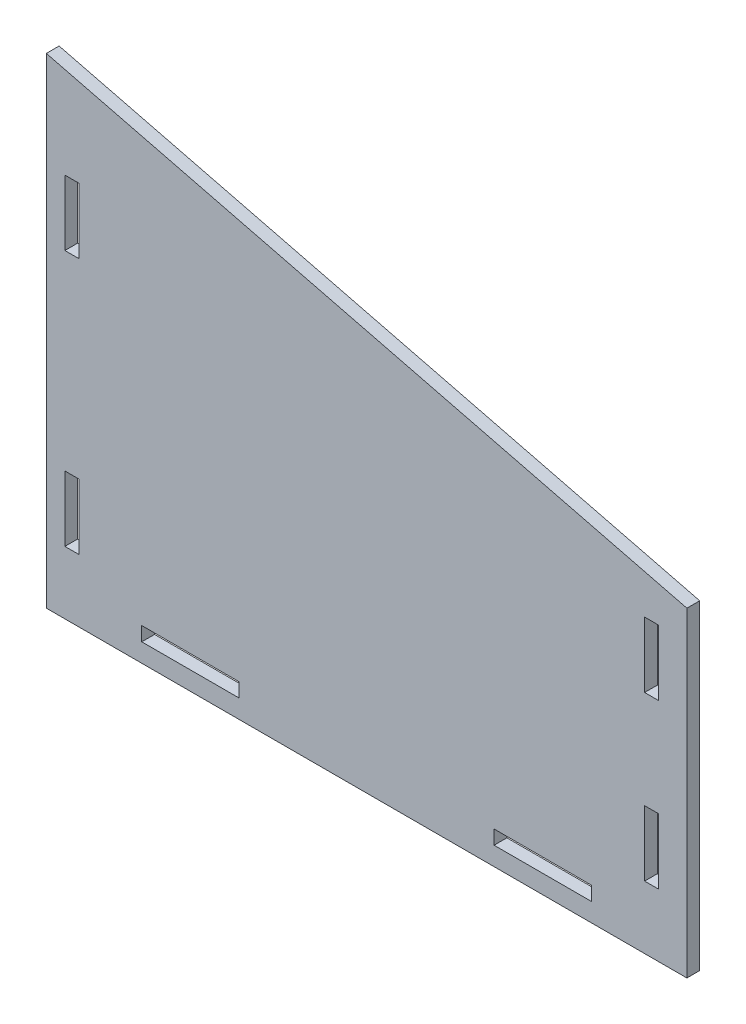
ISO-10303-21;
HEADER;
FILE_DESCRIPTION(('STEP AP214'),'2;1');
FILE_NAME('part.step','',(''),(''),'','','');
FILE_SCHEMA(('AUTOMOTIVE_DESIGN { 1 0 10303 214 1 1 1 1 }'));
ENDSEC;
DATA;
#1=APPLICATION_CONTEXT('core data for automotive mechanical design processes');
#2=APPLICATION_PROTOCOL_DEFINITION('international standard','automotive_design',2000,#1);
#3=PRODUCT_CONTEXT('',#1,'mechanical');
#4=PRODUCT('Part','Part','',(#3));
#5=PRODUCT_RELATED_PRODUCT_CATEGORY('part','',(#4));
#6=PRODUCT_DEFINITION_FORMATION('','',#4);
#7=PRODUCT_DEFINITION_CONTEXT('part definition',#1,'design');
#8=PRODUCT_DEFINITION('design','',#6,#7);
#9=PRODUCT_DEFINITION_SHAPE('','',#8);
#10=(LENGTH_UNIT() NAMED_UNIT(*) SI_UNIT(.MILLI.,.METRE.));
#11=(NAMED_UNIT(*) PLANE_ANGLE_UNIT() SI_UNIT($,.RADIAN.));
#12=(NAMED_UNIT(*) SI_UNIT($,.STERADIAN.) SOLID_ANGLE_UNIT());
#13=UNCERTAINTY_MEASURE_WITH_UNIT(LENGTH_MEASURE(1.E-05),#10,'distance_accuracy_value','');
#14=(GEOMETRIC_REPRESENTATION_CONTEXT(3) GLOBAL_UNCERTAINTY_ASSIGNED_CONTEXT((#13)) GLOBAL_UNIT_ASSIGNED_CONTEXT((#10,
#11,#12)) REPRESENTATION_CONTEXT('',''));
#15=CARTESIAN_POINT('',(0.,0.,0.));
#16=DIRECTION('',(0.,0.,1.));
#17=DIRECTION('',(1.,0.,0.));
#18=AXIS2_PLACEMENT_3D('',#15,#16,#17);
#19=CARTESIAN_POINT('',(0.,0.,4.));
#20=DIRECTION('',(0.,0.,1.));
#21=DIRECTION('',(1.,0.,0.));
#22=AXIS2_PLACEMENT_3D('',#19,#20,#21);
#23=PLANE('',#22);
#24=DIRECTION('',(1.,0.,0.));
#25=VECTOR('',#24,1.);
#26=CARTESIAN_POINT('',(0.,0.,4.));
#27=LINE('',#26,#25);
#28=CARTESIAN_POINT('',(0.,0.,4.));
#29=VERTEX_POINT('',#28);
#30=CARTESIAN_POINT('',(200.,0.,4.));
#31=VERTEX_POINT('',#30);
#32=EDGE_CURVE('E411',#29,#31,#27,.T.);
#33=ORIENTED_EDGE('',*,*,#32,.T.);
#34=DIRECTION('',(0.,1.,0.));
#35=VECTOR('',#34,1.);
#36=CARTESIAN_POINT('',(200.,0.,4.));
#37=LINE('',#36,#35);
#38=CARTESIAN_POINT('',(200.,100.,4.));
#39=VERTEX_POINT('',#38);
#40=EDGE_CURVE('E414',#31,#39,#37,.T.);
#41=ORIENTED_EDGE('',*,*,#40,.T.);
#42=DIRECTION('',(-0.970142500145332,0.242535625036333,0.));
#43=VECTOR('',#42,1.);
#44=CARTESIAN_POINT('',(200.,100.,4.));
#45=LINE('',#44,#43);
#46=CARTESIAN_POINT('',(0.,150.,4.));
#47=VERTEX_POINT('',#46);
#48=EDGE_CURVE('E417',#39,#47,#45,.T.);
#49=ORIENTED_EDGE('',*,*,#48,.T.);
#50=DIRECTION('',(0.,-1.,0.));
#51=VECTOR('',#50,1.);
#52=CARTESIAN_POINT('',(0.,0.,4.));
#53=LINE('',#52,#51);
#54=EDGE_CURVE('E419',#47,#29,#53,.T.);
#55=ORIENTED_EDGE('',*,*,#54,.T.);
#56=EDGE_LOOP('',(#33,#41,#49,#55));
#57=FACE_BOUND('',#56,.T.);
#58=DIRECTION('',(1.,0.,0.));
#59=VECTOR('',#58,1.);
#60=CARTESIAN_POINT('',(186.8,19.6,4.));
#61=LINE('',#60,#59);
#62=CARTESIAN_POINT('',(186.8,19.6,4.));
#63=VERTEX_POINT('',#62);
#64=CARTESIAN_POINT('',(191.2,19.6,4.));
#65=VERTEX_POINT('',#64);
#66=EDGE_CURVE('E382',#63,#65,#61,.T.);
#67=ORIENTED_EDGE('',*,*,#66,.F.);
#68=DIRECTION('',(0.,-1.,0.));
#69=VECTOR('',#68,1.);
#70=CARTESIAN_POINT('',(186.8,40.,4.));
#71=LINE('',#70,#69);
#72=CARTESIAN_POINT('',(186.8,40.,4.));
#73=VERTEX_POINT('',#72);
#74=EDGE_CURVE('E380',#73,#63,#71,.T.);
#75=ORIENTED_EDGE('',*,*,#74,.F.);
#76=DIRECTION('',(-1.,0.,0.));
#77=VECTOR('',#76,1.);
#78=CARTESIAN_POINT('',(186.8,40.,4.));
#79=LINE('',#78,#77);
#80=CARTESIAN_POINT('',(191.2,40.,4.));
#81=VERTEX_POINT('',#80);
#82=EDGE_CURVE('E388',#81,#73,#79,.T.);
#83=ORIENTED_EDGE('',*,*,#82,.F.);
#84=DIRECTION('',(0.,1.,0.));
#85=VECTOR('',#84,1.);
#86=CARTESIAN_POINT('',(191.2,40.,4.));
#87=LINE('',#86,#85);
#88=EDGE_CURVE('E385',#65,#81,#87,.T.);
#89=ORIENTED_EDGE('',*,*,#88,.F.);
#90=EDGE_LOOP('',(#67,#75,#83,#89));
#91=FACE_BOUND('',#90,.T.);
#92=DIRECTION('',(1.,0.,0.));
#93=VECTOR('',#92,1.);
#94=CARTESIAN_POINT('',(139.8,5.8,4.));
#95=LINE('',#94,#93);
#96=CARTESIAN_POINT('',(139.8,5.8,4.));
#97=VERTEX_POINT('',#96);
#98=CARTESIAN_POINT('',(170.2,5.8,4.));
#99=VERTEX_POINT('',#98);
#100=EDGE_CURVE('E351',#97,#99,#95,.T.);
#101=ORIENTED_EDGE('',*,*,#100,.F.);
#102=DIRECTION('',(0.,-1.,0.));
#103=VECTOR('',#102,1.);
#104=CARTESIAN_POINT('',(139.8,10.2,4.));
#105=LINE('',#104,#103);
#106=CARTESIAN_POINT('',(139.8,10.2,4.));
#107=VERTEX_POINT('',#106);
#108=EDGE_CURVE('E349',#107,#97,#105,.T.);
#109=ORIENTED_EDGE('',*,*,#108,.F.);
#110=DIRECTION('',(-1.,0.,0.));
#111=VECTOR('',#110,1.);
#112=CARTESIAN_POINT('',(139.8,10.2,4.));
#113=LINE('',#112,#111);
#114=CARTESIAN_POINT('',(170.2,10.2,4.));
#115=VERTEX_POINT('',#114);
#116=EDGE_CURVE('E357',#115,#107,#113,.T.);
#117=ORIENTED_EDGE('',*,*,#116,.F.);
#118=DIRECTION('',(0.,1.,0.));
#119=VECTOR('',#118,1.);
#120=CARTESIAN_POINT('',(170.2,10.2,4.));
#121=LINE('',#120,#119);
#122=EDGE_CURVE('E354',#99,#115,#121,.T.);
#123=ORIENTED_EDGE('',*,*,#122,.F.);
#124=EDGE_LOOP('',(#101,#109,#117,#123));
#125=FACE_BOUND('',#124,.T.);
#126=DIRECTION('',(1.,0.,0.));
#127=VECTOR('',#126,1.);
#128=CARTESIAN_POINT('',(5.8,19.6,4.));
#129=LINE('',#128,#127);
#130=CARTESIAN_POINT('',(5.8,19.6,4.));
#131=VERTEX_POINT('',#130);
#132=CARTESIAN_POINT('',(10.2,19.6,4.));
#133=VERTEX_POINT('',#132);
#134=EDGE_CURVE('E320',#131,#133,#129,.T.);
#135=ORIENTED_EDGE('',*,*,#134,.F.);
#136=DIRECTION('',(0.,-1.,0.));
#137=VECTOR('',#136,1.);
#138=CARTESIAN_POINT('',(5.8,40.,4.));
#139=LINE('',#138,#137);
#140=CARTESIAN_POINT('',(5.8,40.,4.));
#141=VERTEX_POINT('',#140);
#142=EDGE_CURVE('E318',#141,#131,#139,.T.);
#143=ORIENTED_EDGE('',*,*,#142,.F.);
#144=DIRECTION('',(-1.,0.,0.));
#145=VECTOR('',#144,1.);
#146=CARTESIAN_POINT('',(5.8,40.,4.));
#147=LINE('',#146,#145);
#148=CARTESIAN_POINT('',(10.2,40.,4.));
#149=VERTEX_POINT('',#148);
#150=EDGE_CURVE('E326',#149,#141,#147,.T.);
#151=ORIENTED_EDGE('',*,*,#150,.F.);
#152=DIRECTION('',(0.,1.,0.));
#153=VECTOR('',#152,1.);
#154=CARTESIAN_POINT('',(10.2,40.,4.));
#155=LINE('',#154,#153);
#156=EDGE_CURVE('E323',#133,#149,#155,.T.);
#157=ORIENTED_EDGE('',*,*,#156,.F.);
#158=EDGE_LOOP('',(#135,#143,#151,#157));
#159=FACE_BOUND('',#158,.T.);
#160=DIRECTION('',(-1.,0.,0.));
#161=VECTOR('',#160,1.);
#162=CARTESIAN_POINT('',(60.2,10.2,4.));
#163=LINE('',#162,#161);
#164=CARTESIAN_POINT('',(60.2,10.2,4.));
#165=VERTEX_POINT('',#164);
#166=CARTESIAN_POINT('',(29.8,10.2,4.));
#167=VERTEX_POINT('',#166);
#168=EDGE_CURVE('E289',#165,#167,#163,.T.);
#169=ORIENTED_EDGE('',*,*,#168,.F.);
#170=DIRECTION('',(0.,1.,0.));
#171=VECTOR('',#170,1.);
#172=CARTESIAN_POINT('',(60.2,10.2,4.));
#173=LINE('',#172,#171);
#174=CARTESIAN_POINT('',(60.2,5.8,4.));
#175=VERTEX_POINT('',#174);
#176=EDGE_CURVE('E287',#175,#165,#173,.T.);
#177=ORIENTED_EDGE('',*,*,#176,.F.);
#178=DIRECTION('',(1.,0.,0.));
#179=VECTOR('',#178,1.);
#180=CARTESIAN_POINT('',(60.2,5.8,4.));
#181=LINE('',#180,#179);
#182=CARTESIAN_POINT('',(29.8,5.8,4.));
#183=VERTEX_POINT('',#182);
#184=EDGE_CURVE('E295',#183,#175,#181,.T.);
#185=ORIENTED_EDGE('',*,*,#184,.F.);
#186=DIRECTION('',(0.,-1.,0.));
#187=VECTOR('',#186,1.);
#188=CARTESIAN_POINT('',(29.8,10.2,4.));
#189=LINE('',#188,#187);
#190=EDGE_CURVE('E292',#167,#183,#189,.T.);
#191=ORIENTED_EDGE('',*,*,#190,.F.);
#192=EDGE_LOOP('',(#169,#177,#185,#191));
#193=FACE_BOUND('',#192,.T.);
#194=DIRECTION('',(1.,0.,0.));
#195=VECTOR('',#194,1.);
#196=CARTESIAN_POINT('',(5.79999999999999,99.6,4.));
#197=LINE('',#196,#195);
#198=CARTESIAN_POINT('',(5.79999999999999,99.6,4.));
#199=VERTEX_POINT('',#198);
#200=CARTESIAN_POINT('',(10.2,99.6,4.));
#201=VERTEX_POINT('',#200);
#202=EDGE_CURVE('E258',#199,#201,#197,.T.);
#203=ORIENTED_EDGE('',*,*,#202,.F.);
#204=DIRECTION('',(0.,-1.,0.));
#205=VECTOR('',#204,1.);
#206=CARTESIAN_POINT('',(5.79999999999999,99.6,4.));
#207=LINE('',#206,#205);
#208=CARTESIAN_POINT('',(5.79999999999999,120.,4.));
#209=VERTEX_POINT('',#208);
#210=EDGE_CURVE('E256',#209,#199,#207,.T.);
#211=ORIENTED_EDGE('',*,*,#210,.F.);
#212=DIRECTION('',(-1.,0.,0.));
#213=VECTOR('',#212,1.);
#214=CARTESIAN_POINT('',(5.79999999999999,120.,4.));
#215=LINE('',#214,#213);
#216=CARTESIAN_POINT('',(10.2,120.,4.));
#217=VERTEX_POINT('',#216);
#218=EDGE_CURVE('E264',#217,#209,#215,.T.);
#219=ORIENTED_EDGE('',*,*,#218,.F.);
#220=DIRECTION('',(0.,1.,0.));
#221=VECTOR('',#220,1.);
#222=CARTESIAN_POINT('',(10.2,99.6,4.));
#223=LINE('',#222,#221);
#224=EDGE_CURVE('E261',#201,#217,#223,.T.);
#225=ORIENTED_EDGE('',*,*,#224,.F.);
#226=EDGE_LOOP('',(#203,#211,#219,#225));
#227=FACE_BOUND('',#226,.T.);
#228=DIRECTION('',(1.,0.,0.));
#229=VECTOR('',#228,1.);
#230=CARTESIAN_POINT('',(186.8,70.6,4.));
#231=LINE('',#230,#229);
#232=CARTESIAN_POINT('',(186.8,70.6,4.));
#233=VERTEX_POINT('',#232);
#234=CARTESIAN_POINT('',(191.2,70.6,4.));
#235=VERTEX_POINT('',#234);
#236=EDGE_CURVE('E228',#233,#235,#231,.T.);
#237=ORIENTED_EDGE('',*,*,#236,.F.);
#238=DIRECTION('',(0.,-1.,0.));
#239=VECTOR('',#238,1.);
#240=CARTESIAN_POINT('',(186.8,70.6,4.));
#241=LINE('',#240,#239);
#242=CARTESIAN_POINT('',(186.8,91.,4.));
#243=VERTEX_POINT('',#242);
#244=EDGE_CURVE('E220',#243,#233,#241,.T.);
#245=ORIENTED_EDGE('',*,*,#244,.F.);
#246=DIRECTION('',(-1.,0.,0.));
#247=VECTOR('',#246,1.);
#248=CARTESIAN_POINT('',(186.8,91.,4.));
#249=LINE('',#248,#247);
#250=CARTESIAN_POINT('',(191.2,91.,4.));
#251=VERTEX_POINT('',#250);
#252=EDGE_CURVE('E242',#251,#243,#249,.T.);
#253=ORIENTED_EDGE('',*,*,#252,.F.);
#254=DIRECTION('',(0.,1.,0.));
#255=VECTOR('',#254,1.);
#256=CARTESIAN_POINT('',(191.2,70.6,4.));
#257=LINE('',#256,#255);
#258=EDGE_CURVE('E240',#235,#251,#257,.T.);
#259=ORIENTED_EDGE('',*,*,#258,.F.);
#260=EDGE_LOOP('',(#237,#245,#253,#259));
#261=FACE_BOUND('',#260,.T.);
#262=ADVANCED_FACE('F35',(#57,#91,#125,#159,#193,#227,#261),#23,.T.);
#263=CARTESIAN_POINT('',(0.,0.,0.));
#264=DIRECTION('',(0.,0.,1.));
#265=DIRECTION('',(1.,0.,0.));
#266=AXIS2_PLACEMENT_3D('',#263,#264,#265);
#267=PLANE('',#266);
#268=DIRECTION('',(0.,-1.,0.));
#269=VECTOR('',#268,1.);
#270=CARTESIAN_POINT('',(5.79999999999999,99.6,0.));
#271=LINE('',#270,#269);
#272=CARTESIAN_POINT('',(5.79999999999999,120.,0.));
#273=VERTEX_POINT('',#272);
#274=CARTESIAN_POINT('',(5.79999999999999,99.6,0.));
#275=VERTEX_POINT('',#274);
#276=EDGE_CURVE('E236',#273,#275,#271,.T.);
#277=ORIENTED_EDGE('',*,*,#276,.T.);
#278=DIRECTION('',(1.,0.,0.));
#279=VECTOR('',#278,1.);
#280=CARTESIAN_POINT('',(5.79999999999999,99.6,0.));
#281=LINE('',#280,#279);
#282=CARTESIAN_POINT('',(10.2,99.6,0.));
#283=VERTEX_POINT('',#282);
#284=EDGE_CURVE('E269',#275,#283,#281,.T.);
#285=ORIENTED_EDGE('',*,*,#284,.T.);
#286=DIRECTION('',(0.,1.,0.));
#287=VECTOR('',#286,1.);
#288=CARTESIAN_POINT('',(10.2,99.6,0.));
#289=LINE('',#288,#287);
#290=CARTESIAN_POINT('',(10.2,120.,0.));
#291=VERTEX_POINT('',#290);
#292=EDGE_CURVE('E272',#283,#291,#289,.T.);
#293=ORIENTED_EDGE('',*,*,#292,.T.);
#294=DIRECTION('',(-1.,0.,0.));
#295=VECTOR('',#294,1.);
#296=CARTESIAN_POINT('',(5.79999999999999,120.,0.));
#297=LINE('',#296,#295);
#298=EDGE_CURVE('E259',#291,#273,#297,.T.);
#299=ORIENTED_EDGE('',*,*,#298,.T.);
#300=EDGE_LOOP('',(#277,#285,#293,#299));
#301=FACE_BOUND('',#300,.T.);
#302=DIRECTION('',(0.,-1.,0.));
#303=VECTOR('',#302,1.);
#304=CARTESIAN_POINT('',(5.8,40.,0.));
#305=LINE('',#304,#303);
#306=CARTESIAN_POINT('',(5.8,40.,0.));
#307=VERTEX_POINT('',#306);
#308=CARTESIAN_POINT('',(5.8,19.6,0.));
#309=VERTEX_POINT('',#308);
#310=EDGE_CURVE('E317',#307,#309,#305,.T.);
#311=ORIENTED_EDGE('',*,*,#310,.T.);
#312=DIRECTION('',(1.,0.,0.));
#313=VECTOR('',#312,1.);
#314=CARTESIAN_POINT('',(5.8,19.6,0.));
#315=LINE('',#314,#313);
#316=CARTESIAN_POINT('',(10.2,19.6,0.));
#317=VERTEX_POINT('',#316);
#318=EDGE_CURVE('E331',#309,#317,#315,.T.);
#319=ORIENTED_EDGE('',*,*,#318,.T.);
#320=DIRECTION('',(0.,1.,0.));
#321=VECTOR('',#320,1.);
#322=CARTESIAN_POINT('',(10.2,40.,0.));
#323=LINE('',#322,#321);
#324=CARTESIAN_POINT('',(10.2,40.,0.));
#325=VERTEX_POINT('',#324);
#326=EDGE_CURVE('E334',#317,#325,#323,.T.);
#327=ORIENTED_EDGE('',*,*,#326,.T.);
#328=DIRECTION('',(-1.,0.,0.));
#329=VECTOR('',#328,1.);
#330=CARTESIAN_POINT('',(5.8,40.,0.));
#331=LINE('',#330,#329);
#332=EDGE_CURVE('E321',#325,#307,#331,.T.);
#333=ORIENTED_EDGE('',*,*,#332,.T.);
#334=EDGE_LOOP('',(#311,#319,#327,#333));
#335=FACE_BOUND('',#334,.T.);
#336=DIRECTION('',(0.,-1.,0.));
#337=VECTOR('',#336,1.);
#338=CARTESIAN_POINT('',(186.8,40.,0.));
#339=LINE('',#338,#337);
#340=CARTESIAN_POINT('',(186.8,40.,0.));
#341=VERTEX_POINT('',#340);
#342=CARTESIAN_POINT('',(186.8,19.6,0.));
#343=VERTEX_POINT('',#342);
#344=EDGE_CURVE('E379',#341,#343,#339,.T.);
#345=ORIENTED_EDGE('',*,*,#344,.T.);
#346=DIRECTION('',(1.,0.,0.));
#347=VECTOR('',#346,1.);
#348=CARTESIAN_POINT('',(186.8,19.6,0.));
#349=LINE('',#348,#347);
#350=CARTESIAN_POINT('',(191.2,19.6,0.));
#351=VERTEX_POINT('',#350);
#352=EDGE_CURVE('E393',#343,#351,#349,.T.);
#353=ORIENTED_EDGE('',*,*,#352,.T.);
#354=DIRECTION('',(0.,1.,0.));
#355=VECTOR('',#354,1.);
#356=CARTESIAN_POINT('',(191.2,40.,0.));
#357=LINE('',#356,#355);
#358=CARTESIAN_POINT('',(191.2,40.,0.));
#359=VERTEX_POINT('',#358);
#360=EDGE_CURVE('E396',#351,#359,#357,.T.);
#361=ORIENTED_EDGE('',*,*,#360,.T.);
#362=DIRECTION('',(-1.,0.,0.));
#363=VECTOR('',#362,1.);
#364=CARTESIAN_POINT('',(186.8,40.,0.));
#365=LINE('',#364,#363);
#366=EDGE_CURVE('E383',#359,#341,#365,.T.);
#367=ORIENTED_EDGE('',*,*,#366,.T.);
#368=EDGE_LOOP('',(#345,#353,#361,#367));
#369=FACE_BOUND('',#368,.T.);
#370=DIRECTION('',(1.,0.,0.));
#371=VECTOR('',#370,1.);
#372=CARTESIAN_POINT('',(0.,0.,0.));
#373=LINE('',#372,#371);
#374=CARTESIAN_POINT('',(0.,0.,0.));
#375=VERTEX_POINT('',#374);
#376=CARTESIAN_POINT('',(200.,0.,0.));
#377=VERTEX_POINT('',#376);
#378=EDGE_CURVE('E410',#375,#377,#373,.T.);
#379=ORIENTED_EDGE('',*,*,#378,.F.);
#380=DIRECTION('',(0.,-1.,0.));
#381=VECTOR('',#380,1.);
#382=CARTESIAN_POINT('',(0.,0.,0.));
#383=LINE('',#382,#381);
#384=CARTESIAN_POINT('',(0.,150.,0.));
#385=VERTEX_POINT('',#384);
#386=EDGE_CURVE('E415',#385,#375,#383,.T.);
#387=ORIENTED_EDGE('',*,*,#386,.F.);
#388=DIRECTION('',(-0.970142500145332,0.242535625036333,0.));
#389=VECTOR('',#388,1.);
#390=CARTESIAN_POINT('',(200.,100.,0.));
#391=LINE('',#390,#389);
#392=CARTESIAN_POINT('',(200.,100.,0.));
#393=VERTEX_POINT('',#392);
#394=EDGE_CURVE('E426',#393,#385,#391,.T.);
#395=ORIENTED_EDGE('',*,*,#394,.F.);
#396=DIRECTION('',(0.,1.,0.));
#397=VECTOR('',#396,1.);
#398=CARTESIAN_POINT('',(200.,0.,0.));
#399=LINE('',#398,#397);
#400=EDGE_CURVE('E424',#377,#393,#399,.T.);
#401=ORIENTED_EDGE('',*,*,#400,.F.);
#402=EDGE_LOOP('',(#379,#387,#395,#401));
#403=FACE_BOUND('',#402,.T.);
#404=DIRECTION('',(0.,-1.,0.));
#405=VECTOR('',#404,1.);
#406=CARTESIAN_POINT('',(139.8,10.2,0.));
#407=LINE('',#406,#405);
#408=CARTESIAN_POINT('',(139.8,10.2,0.));
#409=VERTEX_POINT('',#408);
#410=CARTESIAN_POINT('',(139.8,5.8,0.));
#411=VERTEX_POINT('',#410);
#412=EDGE_CURVE('E348',#409,#411,#407,.T.);
#413=ORIENTED_EDGE('',*,*,#412,.T.);
#414=DIRECTION('',(1.,0.,0.));
#415=VECTOR('',#414,1.);
#416=CARTESIAN_POINT('',(139.8,5.8,0.));
#417=LINE('',#416,#415);
#418=CARTESIAN_POINT('',(170.2,5.8,0.));
#419=VERTEX_POINT('',#418);
#420=EDGE_CURVE('E362',#411,#419,#417,.T.);
#421=ORIENTED_EDGE('',*,*,#420,.T.);
#422=DIRECTION('',(0.,1.,0.));
#423=VECTOR('',#422,1.);
#424=CARTESIAN_POINT('',(170.2,10.2,0.));
#425=LINE('',#424,#423);
#426=CARTESIAN_POINT('',(170.2,10.2,0.));
#427=VERTEX_POINT('',#426);
#428=EDGE_CURVE('E365',#419,#427,#425,.T.);
#429=ORIENTED_EDGE('',*,*,#428,.T.);
#430=DIRECTION('',(-1.,0.,0.));
#431=VECTOR('',#430,1.);
#432=CARTESIAN_POINT('',(139.8,10.2,0.));
#433=LINE('',#432,#431);
#434=EDGE_CURVE('E352',#427,#409,#433,.T.);
#435=ORIENTED_EDGE('',*,*,#434,.T.);
#436=EDGE_LOOP('',(#413,#421,#429,#435));
#437=FACE_BOUND('',#436,.T.);
#438=DIRECTION('',(0.,1.,0.));
#439=VECTOR('',#438,1.);
#440=CARTESIAN_POINT('',(60.2,10.2,0.));
#441=LINE('',#440,#439);
#442=CARTESIAN_POINT('',(60.2,5.8,0.));
#443=VERTEX_POINT('',#442);
#444=CARTESIAN_POINT('',(60.2,10.2,0.));
#445=VERTEX_POINT('',#444);
#446=EDGE_CURVE('E286',#443,#445,#441,.T.);
#447=ORIENTED_EDGE('',*,*,#446,.T.);
#448=DIRECTION('',(-1.,0.,0.));
#449=VECTOR('',#448,1.);
#450=CARTESIAN_POINT('',(60.2,10.2,0.));
#451=LINE('',#450,#449);
#452=CARTESIAN_POINT('',(29.8,10.2,0.));
#453=VERTEX_POINT('',#452);
#454=EDGE_CURVE('E300',#445,#453,#451,.T.);
#455=ORIENTED_EDGE('',*,*,#454,.T.);
#456=DIRECTION('',(0.,-1.,0.));
#457=VECTOR('',#456,1.);
#458=CARTESIAN_POINT('',(29.8,10.2,0.));
#459=LINE('',#458,#457);
#460=CARTESIAN_POINT('',(29.8,5.8,0.));
#461=VERTEX_POINT('',#460);
#462=EDGE_CURVE('E303',#453,#461,#459,.T.);
#463=ORIENTED_EDGE('',*,*,#462,.T.);
#464=DIRECTION('',(1.,0.,0.));
#465=VECTOR('',#464,1.);
#466=CARTESIAN_POINT('',(60.2,5.8,0.));
#467=LINE('',#466,#465);
#468=EDGE_CURVE('E290',#461,#443,#467,.T.);
#469=ORIENTED_EDGE('',*,*,#468,.T.);
#470=EDGE_LOOP('',(#447,#455,#463,#469));
#471=FACE_BOUND('',#470,.T.);
#472=DIRECTION('',(0.,-1.,0.));
#473=VECTOR('',#472,1.);
#474=CARTESIAN_POINT('',(186.8,70.6,0.));
#475=LINE('',#474,#473);
#476=CARTESIAN_POINT('',(186.8,91.,0.));
#477=VERTEX_POINT('',#476);
#478=CARTESIAN_POINT('',(186.8,70.6,0.));
#479=VERTEX_POINT('',#478);
#480=EDGE_CURVE('E58',#477,#479,#475,.T.);
#481=ORIENTED_EDGE('',*,*,#480,.T.);
#482=DIRECTION('',(1.,0.,0.));
#483=VECTOR('',#482,1.);
#484=CARTESIAN_POINT('',(186.8,70.6,0.));
#485=LINE('',#484,#483);
#486=CARTESIAN_POINT('',(191.2,70.6,0.));
#487=VERTEX_POINT('',#486);
#488=EDGE_CURVE('E235',#479,#487,#485,.T.);
#489=ORIENTED_EDGE('',*,*,#488,.T.);
#490=DIRECTION('',(0.,1.,0.));
#491=VECTOR('',#490,1.);
#492=CARTESIAN_POINT('',(191.2,70.6,0.));
#493=LINE('',#492,#491);
#494=CARTESIAN_POINT('',(191.2,91.,0.));
#495=VERTEX_POINT('',#494);
#496=EDGE_CURVE('E248',#487,#495,#493,.T.);
#497=ORIENTED_EDGE('',*,*,#496,.T.);
#498=DIRECTION('',(-1.,0.,0.));
#499=VECTOR('',#498,1.);
#500=CARTESIAN_POINT('',(186.8,91.,0.));
#501=LINE('',#500,#499);
#502=EDGE_CURVE('E229',#495,#477,#501,.T.);
#503=ORIENTED_EDGE('',*,*,#502,.T.);
#504=EDGE_LOOP('',(#481,#489,#497,#503));
#505=FACE_BOUND('',#504,.T.);
#506=ADVANCED_FACE('F444',(#301,#335,#369,#403,#437,#471,#505),#267,.F.);
#507=CARTESIAN_POINT('',(0.,0.,4.));
#508=DIRECTION('',(0.,1.,0.));
#509=DIRECTION('',(0.,0.,1.));
#510=AXIS2_PLACEMENT_3D('',#507,#508,#509);
#511=PLANE('',#510);
#512=ORIENTED_EDGE('',*,*,#378,.T.);
#513=DIRECTION('',(0.,0.,-1.));
#514=VECTOR('',#513,1.);
#515=CARTESIAN_POINT('',(200.,0.,4.));
#516=LINE('',#515,#514);
#517=EDGE_CURVE('E11',#31,#377,#516,.T.);
#518=ORIENTED_EDGE('',*,*,#517,.F.);
#519=ORIENTED_EDGE('',*,*,#32,.F.);
#520=DIRECTION('',(0.,0.,-1.));
#521=VECTOR('',#520,1.);
#522=CARTESIAN_POINT('',(0.,0.,4.));
#523=LINE('',#522,#521);
#524=EDGE_CURVE('E421',#29,#375,#523,.T.);
#525=ORIENTED_EDGE('',*,*,#524,.T.);
#526=EDGE_LOOP('',(#512,#518,#519,#525));
#527=FACE_BOUND('',#526,.T.);
#528=ADVANCED_FACE('F37',(#527),#511,.F.);
#529=CARTESIAN_POINT('',(200.,0.,4.));
#530=DIRECTION('',(-1.,0.,0.));
#531=DIRECTION('',(0.,0.,1.));
#532=AXIS2_PLACEMENT_3D('',#529,#530,#531);
#533=PLANE('',#532);
#534=ORIENTED_EDGE('',*,*,#400,.T.);
#535=DIRECTION('',(0.,0.,-1.));
#536=VECTOR('',#535,1.);
#537=CARTESIAN_POINT('',(200.,100.,4.));
#538=LINE('',#537,#536);
#539=EDGE_CURVE('E43',#39,#393,#538,.T.);
#540=ORIENTED_EDGE('',*,*,#539,.F.);
#541=ORIENTED_EDGE('',*,*,#40,.F.);
#542=ORIENTED_EDGE('',*,*,#517,.T.);
#543=EDGE_LOOP('',(#534,#540,#541,#542));
#544=FACE_BOUND('',#543,.T.);
#545=ADVANCED_FACE('F455',(#544),#533,.F.);
#546=CARTESIAN_POINT('',(200.,100.,4.));
#547=DIRECTION('',(-0.242535625036333,-0.970142500145332,0.));
#548=DIRECTION('',(0.970142500145332,-0.242535625036333,0.));
#549=AXIS2_PLACEMENT_3D('',#546,#547,#548);
#550=PLANE('',#549);
#551=ORIENTED_EDGE('',*,*,#394,.T.);
#552=DIRECTION('',(0.,0.,-1.));
#553=VECTOR('',#552,1.);
#554=CARTESIAN_POINT('',(0.,150.,4.));
#555=LINE('',#554,#553);
#556=EDGE_CURVE('E431',#47,#385,#555,.T.);
#557=ORIENTED_EDGE('',*,*,#556,.F.);
#558=ORIENTED_EDGE('',*,*,#48,.F.);
#559=ORIENTED_EDGE('',*,*,#539,.T.);
#560=EDGE_LOOP('',(#551,#557,#558,#559));
#561=FACE_BOUND('',#560,.T.);
#562=ADVANCED_FACE('F438',(#561),#550,.F.);
#563=CARTESIAN_POINT('',(0.,0.,4.));
#564=DIRECTION('',(1.,0.,0.));
#565=DIRECTION('',(0.,0.,-1.));
#566=AXIS2_PLACEMENT_3D('',#563,#564,#565);
#567=PLANE('',#566);
#568=ORIENTED_EDGE('',*,*,#386,.T.);
#569=ORIENTED_EDGE('',*,*,#524,.F.);
#570=ORIENTED_EDGE('',*,*,#54,.F.);
#571=ORIENTED_EDGE('',*,*,#556,.T.);
#572=EDGE_LOOP('',(#568,#569,#570,#571));
#573=FACE_BOUND('',#572,.T.);
#574=ADVANCED_FACE('F448',(#573),#567,.F.);
#575=CARTESIAN_POINT('',(186.8,40.,4.));
#576=DIRECTION('',(1.,0.,0.));
#577=DIRECTION('',(0.,0.,-1.));
#578=AXIS2_PLACEMENT_3D('',#575,#576,#577);
#579=PLANE('',#578);
#580=ORIENTED_EDGE('',*,*,#344,.F.);
#581=DIRECTION('',(0.,0.,-1.));
#582=VECTOR('',#581,1.);
#583=CARTESIAN_POINT('',(186.8,40.,4.));
#584=LINE('',#583,#582);
#585=EDGE_CURVE('E390',#73,#341,#584,.T.);
#586=ORIENTED_EDGE('',*,*,#585,.F.);
#587=ORIENTED_EDGE('',*,*,#74,.T.);
#588=DIRECTION('',(0.,0.,-1.));
#589=VECTOR('',#588,1.);
#590=CARTESIAN_POINT('',(186.8,19.6,4.));
#591=LINE('',#590,#589);
#592=EDGE_CURVE('E407',#63,#343,#591,.T.);
#593=ORIENTED_EDGE('',*,*,#592,.T.);
#594=EDGE_LOOP('',(#580,#586,#587,#593));
#595=FACE_BOUND('',#594,.T.);
#596=ADVANCED_FACE('F470',(#595),#579,.T.);
#597=CARTESIAN_POINT('',(186.8,19.6,4.));
#598=DIRECTION('',(0.,1.,0.));
#599=DIRECTION('',(0.,0.,1.));
#600=AXIS2_PLACEMENT_3D('',#597,#598,#599);
#601=PLANE('',#600);
#602=ORIENTED_EDGE('',*,*,#352,.F.);
#603=ORIENTED_EDGE('',*,*,#592,.F.);
#604=ORIENTED_EDGE('',*,*,#66,.T.);
#605=DIRECTION('',(0.,0.,-1.));
#606=VECTOR('',#605,1.);
#607=CARTESIAN_POINT('',(191.2,19.6,4.));
#608=LINE('',#607,#606);
#609=EDGE_CURVE('E405',#65,#351,#608,.T.);
#610=ORIENTED_EDGE('',*,*,#609,.T.);
#611=EDGE_LOOP('',(#602,#603,#604,#610));
#612=FACE_BOUND('',#611,.T.);
#613=ADVANCED_FACE('F477',(#612),#601,.T.);
#614=CARTESIAN_POINT('',(191.2,40.,4.));
#615=DIRECTION('',(-1.,0.,0.));
#616=DIRECTION('',(0.,0.,1.));
#617=AXIS2_PLACEMENT_3D('',#614,#615,#616);
#618=PLANE('',#617);
#619=ORIENTED_EDGE('',*,*,#360,.F.);
#620=ORIENTED_EDGE('',*,*,#609,.F.);
#621=ORIENTED_EDGE('',*,*,#88,.T.);
#622=DIRECTION('',(0.,0.,-1.));
#623=VECTOR('',#622,1.);
#624=CARTESIAN_POINT('',(191.2,40.,4.));
#625=LINE('',#624,#623);
#626=EDGE_CURVE('E403',#81,#359,#625,.T.);
#627=ORIENTED_EDGE('',*,*,#626,.T.);
#628=EDGE_LOOP('',(#619,#620,#621,#627));
#629=FACE_BOUND('',#628,.T.);
#630=ADVANCED_FACE('F482',(#629),#618,.T.);
#631=CARTESIAN_POINT('',(186.8,40.,4.));
#632=DIRECTION('',(0.,-1.,0.));
#633=DIRECTION('',(0.,0.,-1.));
#634=AXIS2_PLACEMENT_3D('',#631,#632,#633);
#635=PLANE('',#634);
#636=ORIENTED_EDGE('',*,*,#366,.F.);
#637=ORIENTED_EDGE('',*,*,#626,.F.);
#638=ORIENTED_EDGE('',*,*,#82,.T.);
#639=ORIENTED_EDGE('',*,*,#585,.T.);
#640=EDGE_LOOP('',(#636,#637,#638,#639));
#641=FACE_BOUND('',#640,.T.);
#642=ADVANCED_FACE('F490',(#641),#635,.T.);
#643=CARTESIAN_POINT('',(139.8,10.2,4.));
#644=DIRECTION('',(1.,0.,0.));
#645=DIRECTION('',(0.,0.,-1.));
#646=AXIS2_PLACEMENT_3D('',#643,#644,#645);
#647=PLANE('',#646);
#648=ORIENTED_EDGE('',*,*,#412,.F.);
#649=DIRECTION('',(0.,0.,-1.));
#650=VECTOR('',#649,1.);
#651=CARTESIAN_POINT('',(139.8,10.2,4.));
#652=LINE('',#651,#650);
#653=EDGE_CURVE('E359',#107,#409,#652,.T.);
#654=ORIENTED_EDGE('',*,*,#653,.F.);
#655=ORIENTED_EDGE('',*,*,#108,.T.);
#656=DIRECTION('',(0.,0.,-1.));
#657=VECTOR('',#656,1.);
#658=CARTESIAN_POINT('',(139.8,5.8,4.));
#659=LINE('',#658,#657);
#660=EDGE_CURVE('E376',#97,#411,#659,.T.);
#661=ORIENTED_EDGE('',*,*,#660,.T.);
#662=EDGE_LOOP('',(#648,#654,#655,#661));
#663=FACE_BOUND('',#662,.T.);
#664=ADVANCED_FACE('F585',(#663),#647,.T.);
#665=CARTESIAN_POINT('',(139.8,5.8,4.));
#666=DIRECTION('',(0.,1.,0.));
#667=DIRECTION('',(-1.,0.,0.));
#668=AXIS2_PLACEMENT_3D('',#665,#666,#667);
#669=PLANE('',#668);
#670=ORIENTED_EDGE('',*,*,#420,.F.);
#671=ORIENTED_EDGE('',*,*,#660,.F.);
#672=ORIENTED_EDGE('',*,*,#100,.T.);
#673=DIRECTION('',(0.,0.,-1.));
#674=VECTOR('',#673,1.);
#675=CARTESIAN_POINT('',(170.2,5.8,4.));
#676=LINE('',#675,#674);
#677=EDGE_CURVE('E374',#99,#419,#676,.T.);
#678=ORIENTED_EDGE('',*,*,#677,.T.);
#679=EDGE_LOOP('',(#670,#671,#672,#678));
#680=FACE_BOUND('',#679,.T.);
#681=ADVANCED_FACE('F581',(#680),#669,.T.);
#682=CARTESIAN_POINT('',(170.2,10.2,4.));
#683=DIRECTION('',(-1.,0.,0.));
#684=DIRECTION('',(0.,0.,1.));
#685=AXIS2_PLACEMENT_3D('',#682,#683,#684);
#686=PLANE('',#685);
#687=ORIENTED_EDGE('',*,*,#428,.F.);
#688=ORIENTED_EDGE('',*,*,#677,.F.);
#689=ORIENTED_EDGE('',*,*,#122,.T.);
#690=DIRECTION('',(0.,0.,-1.));
#691=VECTOR('',#690,1.);
#692=CARTESIAN_POINT('',(170.2,10.2,4.));
#693=LINE('',#692,#691);
#694=EDGE_CURVE('E372',#115,#427,#693,.T.);
#695=ORIENTED_EDGE('',*,*,#694,.T.);
#696=EDGE_LOOP('',(#687,#688,#689,#695));
#697=FACE_BOUND('',#696,.T.);
#698=ADVANCED_FACE('F577',(#697),#686,.T.);
#699=CARTESIAN_POINT('',(139.8,10.2,4.));
#700=DIRECTION('',(0.,-1.,0.));
#701=DIRECTION('',(0.,0.,-1.));
#702=AXIS2_PLACEMENT_3D('',#699,#700,#701);
#703=PLANE('',#702);
#704=ORIENTED_EDGE('',*,*,#434,.F.);
#705=ORIENTED_EDGE('',*,*,#694,.F.);
#706=ORIENTED_EDGE('',*,*,#116,.T.);
#707=ORIENTED_EDGE('',*,*,#653,.T.);
#708=EDGE_LOOP('',(#704,#705,#706,#707));
#709=FACE_BOUND('',#708,.T.);
#710=ADVANCED_FACE('F573',(#709),#703,.T.);
#711=CARTESIAN_POINT('',(5.8,40.,4.));
#712=DIRECTION('',(1.,0.,0.));
#713=DIRECTION('',(0.,1.,0.));
#714=AXIS2_PLACEMENT_3D('',#711,#712,#713);
#715=PLANE('',#714);
#716=ORIENTED_EDGE('',*,*,#310,.F.);
#717=DIRECTION('',(0.,0.,-1.));
#718=VECTOR('',#717,1.);
#719=CARTESIAN_POINT('',(5.8,40.,4.));
#720=LINE('',#719,#718);
#721=EDGE_CURVE('E328',#141,#307,#720,.T.);
#722=ORIENTED_EDGE('',*,*,#721,.F.);
#723=ORIENTED_EDGE('',*,*,#142,.T.);
#724=DIRECTION('',(0.,0.,-1.));
#725=VECTOR('',#724,1.);
#726=CARTESIAN_POINT('',(5.8,19.6,4.));
#727=LINE('',#726,#725);
#728=EDGE_CURVE('E345',#131,#309,#727,.T.);
#729=ORIENTED_EDGE('',*,*,#728,.T.);
#730=EDGE_LOOP('',(#716,#722,#723,#729));
#731=FACE_BOUND('',#730,.T.);
#732=ADVANCED_FACE('F569',(#731),#715,.T.);
#733=CARTESIAN_POINT('',(5.8,19.6,4.));
#734=DIRECTION('',(0.,1.,0.));
#735=DIRECTION('',(0.,0.,1.));
#736=AXIS2_PLACEMENT_3D('',#733,#734,#735);
#737=PLANE('',#736);
#738=ORIENTED_EDGE('',*,*,#318,.F.);
#739=ORIENTED_EDGE('',*,*,#728,.F.);
#740=ORIENTED_EDGE('',*,*,#134,.T.);
#741=DIRECTION('',(0.,0.,-1.));
#742=VECTOR('',#741,1.);
#743=CARTESIAN_POINT('',(10.2,19.6,4.));
#744=LINE('',#743,#742);
#745=EDGE_CURVE('E343',#133,#317,#744,.T.);
#746=ORIENTED_EDGE('',*,*,#745,.T.);
#747=EDGE_LOOP('',(#738,#739,#740,#746));
#748=FACE_BOUND('',#747,.T.);
#749=ADVANCED_FACE('F565',(#748),#737,.T.);
#750=CARTESIAN_POINT('',(10.2,40.,4.));
#751=DIRECTION('',(-1.,0.,0.));
#752=DIRECTION('',(0.,0.,1.));
#753=AXIS2_PLACEMENT_3D('',#750,#751,#752);
#754=PLANE('',#753);
#755=ORIENTED_EDGE('',*,*,#326,.F.);
#756=ORIENTED_EDGE('',*,*,#745,.F.);
#757=ORIENTED_EDGE('',*,*,#156,.T.);
#758=DIRECTION('',(0.,0.,-1.));
#759=VECTOR('',#758,1.);
#760=CARTESIAN_POINT('',(10.2,40.,4.));
#761=LINE('',#760,#759);
#762=EDGE_CURVE('E341',#149,#325,#761,.T.);
#763=ORIENTED_EDGE('',*,*,#762,.T.);
#764=EDGE_LOOP('',(#755,#756,#757,#763));
#765=FACE_BOUND('',#764,.T.);
#766=ADVANCED_FACE('F561',(#765),#754,.T.);
#767=CARTESIAN_POINT('',(5.8,40.,4.));
#768=DIRECTION('',(0.,-1.,0.));
#769=DIRECTION('',(0.,0.,-1.));
#770=AXIS2_PLACEMENT_3D('',#767,#768,#769);
#771=PLANE('',#770);
#772=ORIENTED_EDGE('',*,*,#332,.F.);
#773=ORIENTED_EDGE('',*,*,#762,.F.);
#774=ORIENTED_EDGE('',*,*,#150,.T.);
#775=ORIENTED_EDGE('',*,*,#721,.T.);
#776=EDGE_LOOP('',(#772,#773,#774,#775));
#777=FACE_BOUND('',#776,.T.);
#778=ADVANCED_FACE('F557',(#777),#771,.T.);
#779=CARTESIAN_POINT('',(60.2,10.2,4.));
#780=DIRECTION('',(-1.,0.,0.));
#781=DIRECTION('',(0.,0.,1.));
#782=AXIS2_PLACEMENT_3D('',#779,#780,#781);
#783=PLANE('',#782);
#784=ORIENTED_EDGE('',*,*,#446,.F.);
#785=DIRECTION('',(0.,0.,-1.));
#786=VECTOR('',#785,1.);
#787=CARTESIAN_POINT('',(60.2,5.8,4.));
#788=LINE('',#787,#786);
#789=EDGE_CURVE('E297',#175,#443,#788,.T.);
#790=ORIENTED_EDGE('',*,*,#789,.F.);
#791=ORIENTED_EDGE('',*,*,#176,.T.);
#792=DIRECTION('',(0.,0.,-1.));
#793=VECTOR('',#792,1.);
#794=CARTESIAN_POINT('',(60.2,10.2,4.));
#795=LINE('',#794,#793);
#796=EDGE_CURVE('E314',#165,#445,#795,.T.);
#797=ORIENTED_EDGE('',*,*,#796,.T.);
#798=EDGE_LOOP('',(#784,#790,#791,#797));
#799=FACE_BOUND('',#798,.T.);
#800=ADVANCED_FACE('F553',(#799),#783,.T.);
#801=CARTESIAN_POINT('',(60.2,10.2,4.));
#802=DIRECTION('',(0.,-1.,0.));
#803=DIRECTION('',(1.,0.,0.));
#804=AXIS2_PLACEMENT_3D('',#801,#802,#803);
#805=PLANE('',#804);
#806=ORIENTED_EDGE('',*,*,#454,.F.);
#807=ORIENTED_EDGE('',*,*,#796,.F.);
#808=ORIENTED_EDGE('',*,*,#168,.T.);
#809=DIRECTION('',(0.,0.,-1.));
#810=VECTOR('',#809,1.);
#811=CARTESIAN_POINT('',(29.8,10.2,4.));
#812=LINE('',#811,#810);
#813=EDGE_CURVE('E312',#167,#453,#812,.T.);
#814=ORIENTED_EDGE('',*,*,#813,.T.);
#815=EDGE_LOOP('',(#806,#807,#808,#814));
#816=FACE_BOUND('',#815,.T.);
#817=ADVANCED_FACE('F549',(#816),#805,.T.);
#818=CARTESIAN_POINT('',(29.8,10.2,4.));
#819=DIRECTION('',(1.,0.,0.));
#820=DIRECTION('',(0.,0.,-1.));
#821=AXIS2_PLACEMENT_3D('',#818,#819,#820);
#822=PLANE('',#821);
#823=ORIENTED_EDGE('',*,*,#462,.F.);
#824=ORIENTED_EDGE('',*,*,#813,.F.);
#825=ORIENTED_EDGE('',*,*,#190,.T.);
#826=DIRECTION('',(0.,0.,-1.));
#827=VECTOR('',#826,1.);
#828=CARTESIAN_POINT('',(29.8,5.8,4.));
#829=LINE('',#828,#827);
#830=EDGE_CURVE('E310',#183,#461,#829,.T.);
#831=ORIENTED_EDGE('',*,*,#830,.T.);
#832=EDGE_LOOP('',(#823,#824,#825,#831));
#833=FACE_BOUND('',#832,.T.);
#834=ADVANCED_FACE('F545',(#833),#822,.T.);
#835=CARTESIAN_POINT('',(60.2,5.8,4.));
#836=DIRECTION('',(0.,1.,0.));
#837=DIRECTION('',(-1.,0.,0.));
#838=AXIS2_PLACEMENT_3D('',#835,#836,#837);
#839=PLANE('',#838);
#840=ORIENTED_EDGE('',*,*,#468,.F.);
#841=ORIENTED_EDGE('',*,*,#830,.F.);
#842=ORIENTED_EDGE('',*,*,#184,.T.);
#843=ORIENTED_EDGE('',*,*,#789,.T.);
#844=EDGE_LOOP('',(#840,#841,#842,#843));
#845=FACE_BOUND('',#844,.T.);
#846=ADVANCED_FACE('F542',(#845),#839,.T.);
#847=CARTESIAN_POINT('',(5.79999999999999,99.6,4.));
#848=DIRECTION('',(1.,0.,0.));
#849=DIRECTION('',(0.,0.,-1.));
#850=AXIS2_PLACEMENT_3D('',#847,#848,#849);
#851=PLANE('',#850);
#852=ORIENTED_EDGE('',*,*,#276,.F.);
#853=DIRECTION('',(0.,0.,-1.));
#854=VECTOR('',#853,1.);
#855=CARTESIAN_POINT('',(5.79999999999999,120.,4.));
#856=LINE('',#855,#854);
#857=EDGE_CURVE('E266',#209,#273,#856,.T.);
#858=ORIENTED_EDGE('',*,*,#857,.F.);
#859=ORIENTED_EDGE('',*,*,#210,.T.);
#860=DIRECTION('',(0.,0.,-1.));
#861=VECTOR('',#860,1.);
#862=CARTESIAN_POINT('',(5.79999999999999,99.6,4.));
#863=LINE('',#862,#861);
#864=EDGE_CURVE('E283',#199,#275,#863,.T.);
#865=ORIENTED_EDGE('',*,*,#864,.T.);
#866=EDGE_LOOP('',(#852,#858,#859,#865));
#867=FACE_BOUND('',#866,.T.);
#868=ADVANCED_FACE('F524',(#867),#851,.T.);
#869=CARTESIAN_POINT('',(5.79999999999999,99.6,4.));
#870=DIRECTION('',(0.,1.,0.));
#871=DIRECTION('',(0.,0.,1.));
#872=AXIS2_PLACEMENT_3D('',#869,#870,#871);
#873=PLANE('',#872);
#874=ORIENTED_EDGE('',*,*,#284,.F.);
#875=ORIENTED_EDGE('',*,*,#864,.F.);
#876=ORIENTED_EDGE('',*,*,#202,.T.);
#877=DIRECTION('',(0.,0.,-1.));
#878=VECTOR('',#877,1.);
#879=CARTESIAN_POINT('',(10.2,99.6,4.));
#880=LINE('',#879,#878);
#881=EDGE_CURVE('E281',#201,#283,#880,.T.);
#882=ORIENTED_EDGE('',*,*,#881,.T.);
#883=EDGE_LOOP('',(#874,#875,#876,#882));
#884=FACE_BOUND('',#883,.T.);
#885=ADVANCED_FACE('F517',(#884),#873,.T.);
#886=CARTESIAN_POINT('',(10.2,99.6,4.));
#887=DIRECTION('',(-1.,0.,0.));
#888=DIRECTION('',(0.,0.,1.));
#889=AXIS2_PLACEMENT_3D('',#886,#887,#888);
#890=PLANE('',#889);
#891=ORIENTED_EDGE('',*,*,#292,.F.);
#892=ORIENTED_EDGE('',*,*,#881,.F.);
#893=ORIENTED_EDGE('',*,*,#224,.T.);
#894=DIRECTION('',(0.,0.,-1.));
#895=VECTOR('',#894,1.);
#896=CARTESIAN_POINT('',(10.2,120.,4.));
#897=LINE('',#896,#895);
#898=EDGE_CURVE('E279',#217,#291,#897,.T.);
#899=ORIENTED_EDGE('',*,*,#898,.T.);
#900=EDGE_LOOP('',(#891,#892,#893,#899));
#901=FACE_BOUND('',#900,.T.);
#902=ADVANCED_FACE('F520',(#901),#890,.T.);
#903=CARTESIAN_POINT('',(5.79999999999999,120.,4.));
#904=DIRECTION('',(0.,-1.,0.));
#905=DIRECTION('',(0.,0.,-1.));
#906=AXIS2_PLACEMENT_3D('',#903,#904,#905);
#907=PLANE('',#906);
#908=ORIENTED_EDGE('',*,*,#298,.F.);
#909=ORIENTED_EDGE('',*,*,#898,.F.);
#910=ORIENTED_EDGE('',*,*,#218,.T.);
#911=ORIENTED_EDGE('',*,*,#857,.T.);
#912=EDGE_LOOP('',(#908,#909,#910,#911));
#913=FACE_BOUND('',#912,.T.);
#914=ADVANCED_FACE('F527',(#913),#907,.T.);
#915=CARTESIAN_POINT('',(186.8,70.6,4.));
#916=DIRECTION('',(1.,0.,0.));
#917=DIRECTION('',(0.,1.,0.));
#918=AXIS2_PLACEMENT_3D('',#915,#916,#917);
#919=PLANE('',#918);
#920=ORIENTED_EDGE('',*,*,#480,.F.);
#921=DIRECTION('',(0.,0.,-1.));
#922=VECTOR('',#921,1.);
#923=CARTESIAN_POINT('',(186.8,91.,4.));
#924=LINE('',#923,#922);
#925=EDGE_CURVE('E224',#243,#477,#924,.T.);
#926=ORIENTED_EDGE('',*,*,#925,.F.);
#927=ORIENTED_EDGE('',*,*,#244,.T.);
#928=DIRECTION('',(0.,0.,-1.));
#929=VECTOR('',#928,1.);
#930=CARTESIAN_POINT('',(186.8,70.6,4.));
#931=LINE('',#930,#929);
#932=EDGE_CURVE('E223',#233,#479,#931,.T.);
#933=ORIENTED_EDGE('',*,*,#932,.T.);
#934=EDGE_LOOP('',(#920,#926,#927,#933));
#935=FACE_BOUND('',#934,.T.);
#936=ADVANCED_FACE('F222',(#935),#919,.T.);
#937=CARTESIAN_POINT('',(186.8,70.6,4.));
#938=DIRECTION('',(0.,1.,0.));
#939=DIRECTION('',(0.,0.,1.));
#940=AXIS2_PLACEMENT_3D('',#937,#938,#939);
#941=PLANE('',#940);
#942=ORIENTED_EDGE('',*,*,#488,.F.);
#943=ORIENTED_EDGE('',*,*,#932,.F.);
#944=ORIENTED_EDGE('',*,*,#236,.T.);
#945=DIRECTION('',(0.,0.,-1.));
#946=VECTOR('',#945,1.);
#947=CARTESIAN_POINT('',(191.2,70.6,4.));
#948=LINE('',#947,#946);
#949=EDGE_CURVE('E237',#235,#487,#948,.T.);
#950=ORIENTED_EDGE('',*,*,#949,.T.);
#951=EDGE_LOOP('',(#942,#943,#944,#950));
#952=FACE_BOUND('',#951,.T.);
#953=ADVANCED_FACE('F232',(#952),#941,.T.);
#954=CARTESIAN_POINT('',(191.2,70.6,4.));
#955=DIRECTION('',(-1.,0.,0.));
#956=DIRECTION('',(0.,0.,1.));
#957=AXIS2_PLACEMENT_3D('',#954,#955,#956);
#958=PLANE('',#957);
#959=ORIENTED_EDGE('',*,*,#496,.F.);
#960=ORIENTED_EDGE('',*,*,#949,.F.);
#961=ORIENTED_EDGE('',*,*,#258,.T.);
#962=DIRECTION('',(0.,0.,-1.));
#963=VECTOR('',#962,1.);
#964=CARTESIAN_POINT('',(191.2,91.,4.));
#965=LINE('',#964,#963);
#966=EDGE_CURVE('E50',#251,#495,#965,.T.);
#967=ORIENTED_EDGE('',*,*,#966,.T.);
#968=EDGE_LOOP('',(#959,#960,#961,#967));
#969=FACE_BOUND('',#968,.T.);
#970=ADVANCED_FACE('F680',(#969),#958,.T.);
#971=CARTESIAN_POINT('',(186.8,91.,4.));
#972=DIRECTION('',(0.,-1.,0.));
#973=DIRECTION('',(0.,0.,-1.));
#974=AXIS2_PLACEMENT_3D('',#971,#972,#973);
#975=PLANE('',#974);
#976=ORIENTED_EDGE('',*,*,#502,.F.);
#977=ORIENTED_EDGE('',*,*,#966,.F.);
#978=ORIENTED_EDGE('',*,*,#252,.T.);
#979=ORIENTED_EDGE('',*,*,#925,.T.);
#980=EDGE_LOOP('',(#976,#977,#978,#979));
#981=FACE_BOUND('',#980,.T.);
#982=ADVANCED_FACE('F688',(#981),#975,.T.);
#983=CLOSED_SHELL('',(#262,#506,#528,#545,#562,#574,#596,#613,#630,#642,#664,#681,#698,#710,
#732,#749,#766,#778,#800,#817,#834,#846,#868,#885,#902,#914,#936,#953,#970,#982));
#984=MANIFOLD_SOLID_BREP('B2',#983);
#985=ADVANCED_BREP_SHAPE_REPRESENTATION('',(#18,#984),#14);
#986=SHAPE_DEFINITION_REPRESENTATION(#9,#985);
ENDSEC;
END-ISO-10303-21;
